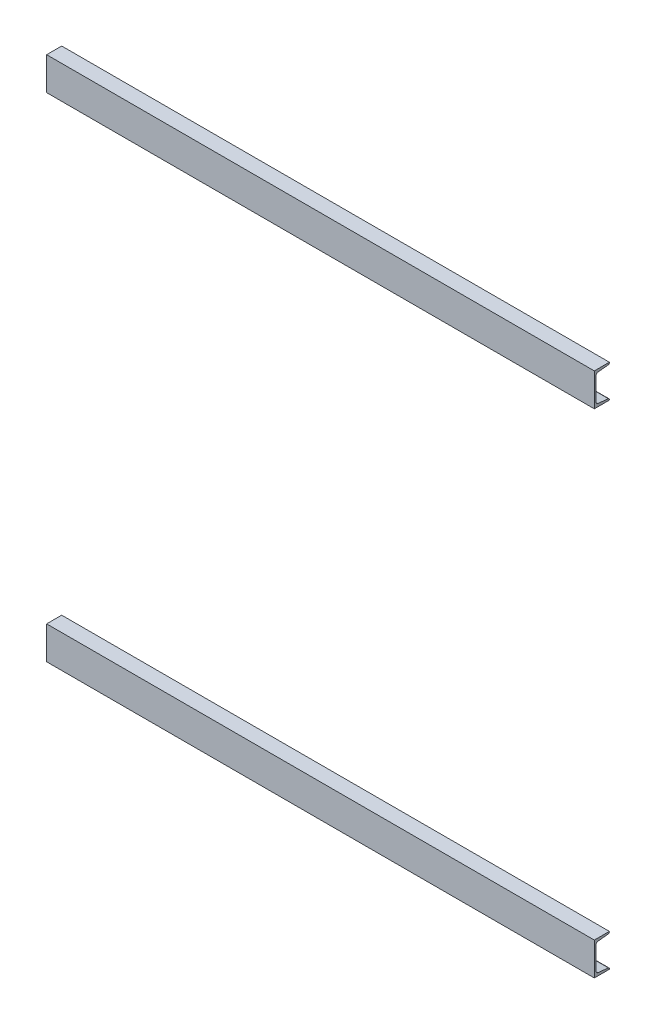
ISO-10303-21;
HEADER;
FILE_DESCRIPTION(('STEP AP214'),'2;1');
FILE_NAME('part.step','',(''),(''),'','','');
FILE_SCHEMA(('AUTOMOTIVE_DESIGN { 1 0 10303 214 1 1 1 1 }'));
ENDSEC;
DATA;
#1=APPLICATION_CONTEXT('core data for automotive mechanical design processes');
#2=APPLICATION_PROTOCOL_DEFINITION('international standard','automotive_design',2000,#1);
#3=PRODUCT_CONTEXT('',#1,'mechanical');
#4=PRODUCT('Part','Part','',(#3));
#5=PRODUCT_RELATED_PRODUCT_CATEGORY('part','',(#4));
#6=PRODUCT_DEFINITION_FORMATION('','',#4);
#7=PRODUCT_DEFINITION_CONTEXT('part definition',#1,'design');
#8=PRODUCT_DEFINITION('design','',#6,#7);
#9=PRODUCT_DEFINITION_SHAPE('','',#8);
#10=(LENGTH_UNIT() NAMED_UNIT(*) SI_UNIT(.MILLI.,.METRE.));
#11=(NAMED_UNIT(*) PLANE_ANGLE_UNIT() SI_UNIT($,.RADIAN.));
#12=(NAMED_UNIT(*) SI_UNIT($,.STERADIAN.) SOLID_ANGLE_UNIT());
#13=UNCERTAINTY_MEASURE_WITH_UNIT(LENGTH_MEASURE(1.E-05),#10,'distance_accuracy_value','');
#14=(GEOMETRIC_REPRESENTATION_CONTEXT(3) GLOBAL_UNCERTAINTY_ASSIGNED_CONTEXT((#13)) GLOBAL_UNIT_ASSIGNED_CONTEXT((#10,
#11,#12)) REPRESENTATION_CONTEXT('',''));
#15=CARTESIAN_POINT('',(0.,0.,0.));
#16=DIRECTION('',(0.,0.,1.));
#17=DIRECTION('',(1.,0.,0.));
#18=AXIS2_PLACEMENT_3D('',#15,#16,#17);
#19=CARTESIAN_POINT('',(1000.,-1018.11362681116,-50.5000000000002));
#20=DIRECTION('',(-1.,0.,0.));
#21=DIRECTION('',(0.,0.,1.));
#22=AXIS2_PLACEMENT_3D('',#19,#20,#21);
#23=CYLINDRICAL_SURFACE('',#22,4.49999999999999);
#24=CARTESIAN_POINT('',(-999.999999999999,-1018.11362681116,-50.5000000000002));
#25=DIRECTION('',(-1.,0.,0.));
#26=DIRECTION('',(0.,0.,1.));
#27=AXIS2_PLACEMENT_3D('',#24,#25,#26);
#28=CIRCLE('',#27,4.49999999999999);
#29=CARTESIAN_POINT('',(-999.999999999999,-1013.638278282,-50.9703780847046));
#30=VERTEX_POINT('',#29);
#31=CARTESIAN_POINT('',(-999.999999999999,-1018.11362681116,-55.0000000000002));
#32=VERTEX_POINT('',#31);
#33=EDGE_CURVE('E206',#30,#32,#28,.T.);
#34=ORIENTED_EDGE('',*,*,#33,.F.);
#35=DIRECTION('',(-1.,0.,0.));
#36=VECTOR('',#35,1.);
#37=CARTESIAN_POINT('',(1000.,-1013.638278282,-50.9703780847046));
#38=LINE('',#37,#36);
#39=CARTESIAN_POINT('',(1000.,-1013.638278282,-50.9703780847046));
#40=VERTEX_POINT('',#39);
#41=EDGE_CURVE('E14',#40,#30,#38,.T.);
#42=ORIENTED_EDGE('',*,*,#41,.F.);
#43=CARTESIAN_POINT('',(1000.,-1018.11362681116,-50.5000000000002));
#44=DIRECTION('',(-1.,0.,0.));
#45=DIRECTION('',(0.,0.,1.));
#46=AXIS2_PLACEMENT_3D('',#43,#44,#45);
#47=CIRCLE('',#46,4.49999999999999);
#48=CARTESIAN_POINT('',(1000.,-1018.11362681116,-55.0000000000002));
#49=VERTEX_POINT('',#48);
#50=EDGE_CURVE('E238',#40,#49,#47,.T.);
#51=ORIENTED_EDGE('',*,*,#50,.T.);
#52=DIRECTION('',(-1.,0.,0.));
#53=VECTOR('',#52,1.);
#54=CARTESIAN_POINT('',(1000.,-1018.11362681116,-55.0000000000002));
#55=LINE('',#54,#53);
#56=EDGE_CURVE('E88',#49,#32,#55,.T.);
#57=ORIENTED_EDGE('',*,*,#56,.T.);
#58=EDGE_LOOP('',(#34,#42,#51,#57));
#59=FACE_BOUND('',#58,.T.);
#60=ADVANCED_FACE('F85',(#59),#23,.T.);
#61=CARTESIAN_POINT('',(1000.,-1009.69617516295,-13.463772293859));
#62=DIRECTION('',(0.,0.994521895368275,-0.104528463267643));
#63=DIRECTION('',(0.,0.104528463267643,0.994521895368275));
#64=AXIS2_PLACEMENT_3D('',#61,#62,#63);
#65=PLANE('',#64);
#66=DIRECTION('',(0.,-0.104528463267643,-0.994521895368274));
#67=VECTOR('',#66,1.);
#68=CARTESIAN_POINT('',(-1000.,-1009.69617516295,-13.463772293859));
#69=LINE('',#68,#67);
#70=CARTESIAN_POINT('',(-1000.,-1009.69617516295,-13.463772293859));
#71=VERTEX_POINT('',#70);
#72=EDGE_CURVE('E236',#71,#30,#69,.T.);
#73=ORIENTED_EDGE('',*,*,#72,.F.);
#74=DIRECTION('',(-1.,0.,0.));
#75=VECTOR('',#74,1.);
#76=CARTESIAN_POINT('',(1000.,-1009.69617516295,-13.463772293859));
#77=LINE('',#76,#75);
#78=CARTESIAN_POINT('',(1000.,-1009.69617516295,-13.463772293859));
#79=VERTEX_POINT('',#78);
#80=EDGE_CURVE('E94',#79,#71,#77,.T.);
#81=ORIENTED_EDGE('',*,*,#80,.F.);
#82=DIRECTION('',(0.,-0.104528463267643,-0.994521895368274));
#83=VECTOR('',#82,1.);
#84=CARTESIAN_POINT('',(1000.,-1009.69617516295,-13.463772293859));
#85=LINE('',#84,#83);
#86=EDGE_CURVE('E196',#79,#40,#85,.T.);
#87=ORIENTED_EDGE('',*,*,#86,.T.);
#88=ORIENTED_EDGE('',*,*,#41,.T.);
#89=EDGE_LOOP('',(#73,#81,#87,#88));
#90=FACE_BOUND('',#89,.T.);
#91=ADVANCED_FACE('F258',(#90),#65,.T.);
#92=CARTESIAN_POINT('',(1000.,-1001.74,-14.3000000000002));
#93=DIRECTION('',(-1.,0.,0.));
#94=DIRECTION('',(0.,0.,1.));
#95=AXIS2_PLACEMENT_3D('',#92,#93,#94);
#96=CYLINDRICAL_SURFACE('',#95,8.00000000000001);
#97=CARTESIAN_POINT('',(-1000.,-1001.74,-14.3000000000002));
#98=DIRECTION('',(1.,0.,0.));
#99=DIRECTION('',(0.,0.,-1.));
#100=AXIS2_PLACEMENT_3D('',#97,#98,#99);
#101=CIRCLE('',#100,8.00000000000001);
#102=CARTESIAN_POINT('',(-1000.,-1001.74,-6.30000000000016));
#103=VERTEX_POINT('',#102);
#104=EDGE_CURVE('E183',#103,#71,#101,.T.);
#105=ORIENTED_EDGE('',*,*,#104,.F.);
#106=DIRECTION('',(-1.,0.,0.));
#107=VECTOR('',#106,1.);
#108=CARTESIAN_POINT('',(1000.,-1001.74,-6.30000000000016));
#109=LINE('',#108,#107);
#110=CARTESIAN_POINT('',(1000.,-1001.74,-6.30000000000016));
#111=VERTEX_POINT('',#110);
#112=EDGE_CURVE('E178',#111,#103,#109,.T.);
#113=ORIENTED_EDGE('',*,*,#112,.F.);
#114=CARTESIAN_POINT('',(1000.,-1001.74,-14.3000000000002));
#115=DIRECTION('',(1.,0.,0.));
#116=DIRECTION('',(0.,0.,-1.));
#117=AXIS2_PLACEMENT_3D('',#114,#115,#116);
#118=CIRCLE('',#117,8.00000000000001);
#119=EDGE_CURVE('E181',#111,#79,#118,.T.);
#120=ORIENTED_EDGE('',*,*,#119,.T.);
#121=ORIENTED_EDGE('',*,*,#80,.T.);
#122=EDGE_LOOP('',(#105,#113,#120,#121));
#123=FACE_BOUND('',#122,.T.);
#124=ADVANCED_FACE('F180',(#123),#96,.F.);
#125=CARTESIAN_POINT('',(1000.,-1001.74,-6.30000000000017));
#126=DIRECTION('',(0.,0.,-1.));
#127=DIRECTION('',(0.,1.,0.));
#128=AXIS2_PLACEMENT_3D('',#125,#126,#127);
#129=PLANE('',#128);
#130=DIRECTION('',(0.,-1.,0.));
#131=VECTOR('',#130,1.);
#132=CARTESIAN_POINT('',(-1000.,-1001.74,-6.30000000000017));
#133=LINE('',#132,#131);
#134=CARTESIAN_POINT('',(-1000.,-918.27,-6.30000000000004));
#135=VERTEX_POINT('',#134);
#136=EDGE_CURVE('E233',#135,#103,#133,.T.);
#137=ORIENTED_EDGE('',*,*,#136,.F.);
#138=DIRECTION('',(-1.,0.,0.));
#139=VECTOR('',#138,1.);
#140=CARTESIAN_POINT('',(1000.,-918.27,-6.30000000000004));
#141=LINE('',#140,#139);
#142=CARTESIAN_POINT('',(1000.,-918.27,-6.30000000000004));
#143=VERTEX_POINT('',#142);
#144=EDGE_CURVE('E188',#143,#135,#141,.T.);
#145=ORIENTED_EDGE('',*,*,#144,.F.);
#146=DIRECTION('',(0.,-1.,0.));
#147=VECTOR('',#146,1.);
#148=CARTESIAN_POINT('',(1000.,-1001.74,-6.30000000000017));
#149=LINE('',#148,#147);
#150=EDGE_CURVE('E194',#143,#111,#149,.T.);
#151=ORIENTED_EDGE('',*,*,#150,.T.);
#152=ORIENTED_EDGE('',*,*,#112,.T.);
#153=EDGE_LOOP('',(#137,#145,#151,#152));
#154=FACE_BOUND('',#153,.T.);
#155=ADVANCED_FACE('F198',(#154),#129,.T.);
#156=CARTESIAN_POINT('',(1000.,-918.27,-14.3));
#157=DIRECTION('',(-1.,0.,0.));
#158=DIRECTION('',(0.,0.,1.));
#159=AXIS2_PLACEMENT_3D('',#156,#157,#158);
#160=CYLINDRICAL_SURFACE('',#159,8.00000000000001);
#161=CARTESIAN_POINT('',(-1000.,-918.27,-14.3));
#162=DIRECTION('',(1.,0.,0.));
#163=DIRECTION('',(0.,0.,1.));
#164=AXIS2_PLACEMENT_3D('',#161,#162,#163);
#165=CIRCLE('',#164,8.00000000000001);
#166=CARTESIAN_POINT('',(-1000.,-910.313824837054,-13.4637722938589));
#167=VERTEX_POINT('',#166);
#168=EDGE_CURVE('E230',#167,#135,#165,.T.);
#169=ORIENTED_EDGE('',*,*,#168,.F.);
#170=DIRECTION('',(-1.,0.,0.));
#171=VECTOR('',#170,1.);
#172=CARTESIAN_POINT('',(1000.,-910.313824837054,-13.4637722938589));
#173=LINE('',#172,#171);
#174=CARTESIAN_POINT('',(1000.,-910.313824837054,-13.4637722938589));
#175=VERTEX_POINT('',#174);
#176=EDGE_CURVE('E242',#175,#167,#173,.T.);
#177=ORIENTED_EDGE('',*,*,#176,.F.);
#178=CARTESIAN_POINT('',(1000.,-918.27,-14.3));
#179=DIRECTION('',(1.,0.,0.));
#180=DIRECTION('',(0.,0.,1.));
#181=AXIS2_PLACEMENT_3D('',#178,#179,#180);
#182=CIRCLE('',#181,8.00000000000001);
#183=EDGE_CURVE('E199',#175,#143,#182,.T.);
#184=ORIENTED_EDGE('',*,*,#183,.T.);
#185=ORIENTED_EDGE('',*,*,#144,.T.);
#186=EDGE_LOOP('',(#169,#177,#184,#185));
#187=FACE_BOUND('',#186,.T.);
#188=ADVANCED_FACE('F271',(#187),#160,.F.);
#189=CARTESIAN_POINT('',(1000.,-910.313824837054,-13.4637722938589));
#190=DIRECTION('',(0.,-0.994521895368274,-0.104528463267647));
#191=DIRECTION('',(0.,0.104528463267647,-0.994521895368274));
#192=AXIS2_PLACEMENT_3D('',#189,#190,#191);
#193=PLANE('',#192);
#194=DIRECTION('',(0.,-0.104528463267647,0.994521895368274));
#195=VECTOR('',#194,1.);
#196=CARTESIAN_POINT('',(-1000.,-910.313824837054,-13.4637722938589));
#197=LINE('',#196,#195);
#198=CARTESIAN_POINT('',(-999.999999999999,-906.371721717996,-50.9703780847044));
#199=VERTEX_POINT('',#198);
#200=EDGE_CURVE('E227',#199,#167,#197,.T.);
#201=ORIENTED_EDGE('',*,*,#200,.F.);
#202=DIRECTION('',(-1.,0.,0.));
#203=VECTOR('',#202,1.);
#204=CARTESIAN_POINT('',(1000.,-906.371721717996,-50.9703780847044));
#205=LINE('',#204,#203);
#206=CARTESIAN_POINT('',(1000.,-906.371721717996,-50.9703780847044));
#207=VERTEX_POINT('',#206);
#208=EDGE_CURVE('E244',#207,#199,#205,.T.);
#209=ORIENTED_EDGE('',*,*,#208,.F.);
#210=DIRECTION('',(0.,-0.104528463267647,0.994521895368274));
#211=VECTOR('',#210,1.);
#212=CARTESIAN_POINT('',(1000.,-910.313824837054,-13.4637722938589));
#213=LINE('',#212,#211);
#214=EDGE_CURVE('E201',#207,#175,#213,.T.);
#215=ORIENTED_EDGE('',*,*,#214,.T.);
#216=ORIENTED_EDGE('',*,*,#176,.T.);
#217=EDGE_LOOP('',(#201,#209,#215,#216));
#218=FACE_BOUND('',#217,.T.);
#219=ADVANCED_FACE('F274',(#218),#193,.T.);
#220=CARTESIAN_POINT('',(1000.,-901.896373188839,-50.5));
#221=DIRECTION('',(-1.,0.,0.));
#222=DIRECTION('',(0.,0.,1.));
#223=AXIS2_PLACEMENT_3D('',#220,#221,#222);
#224=CYLINDRICAL_SURFACE('',#223,4.49999999999999);
#225=CARTESIAN_POINT('',(-999.999999999999,-901.896373188839,-50.5));
#226=DIRECTION('',(-1.,0.,0.));
#227=DIRECTION('',(0.,0.,-1.));
#228=AXIS2_PLACEMENT_3D('',#225,#226,#227);
#229=CIRCLE('',#228,4.49999999999999);
#230=CARTESIAN_POINT('',(-999.999999999999,-901.896373188839,-55.));
#231=VERTEX_POINT('',#230);
#232=EDGE_CURVE('E224',#231,#199,#229,.T.);
#233=ORIENTED_EDGE('',*,*,#232,.F.);
#234=DIRECTION('',(-1.,0.,0.));
#235=VECTOR('',#234,1.);
#236=CARTESIAN_POINT('',(1000.,-901.896373188839,-55.));
#237=LINE('',#236,#235);
#238=CARTESIAN_POINT('',(1000.,-901.896373188839,-55.));
#239=VERTEX_POINT('',#238);
#240=EDGE_CURVE('E246',#239,#231,#237,.T.);
#241=ORIENTED_EDGE('',*,*,#240,.F.);
#242=CARTESIAN_POINT('',(1000.,-901.896373188839,-50.5));
#243=DIRECTION('',(-1.,0.,0.));
#244=DIRECTION('',(0.,0.,-1.));
#245=AXIS2_PLACEMENT_3D('',#242,#243,#244);
#246=CIRCLE('',#245,4.49999999999999);
#247=EDGE_CURVE('E428',#239,#207,#246,.T.);
#248=ORIENTED_EDGE('',*,*,#247,.T.);
#249=ORIENTED_EDGE('',*,*,#208,.T.);
#250=EDGE_LOOP('',(#233,#241,#248,#249));
#251=FACE_BOUND('',#250,.T.);
#252=ADVANCED_FACE('F278',(#251),#224,.T.);
#253=CARTESIAN_POINT('',(1000.,-900.,-55.));
#254=DIRECTION('',(0.,0.,-1.));
#255=DIRECTION('',(0.,1.,0.));
#256=AXIS2_PLACEMENT_3D('',#253,#254,#255);
#257=PLANE('',#256);
#258=DIRECTION('',(0.,-1.,0.));
#259=VECTOR('',#258,1.);
#260=CARTESIAN_POINT('',(-999.999999999999,-900.,-55.));
#261=LINE('',#260,#259);
#262=CARTESIAN_POINT('',(-999.999999999999,-900.,-55.));
#263=VERTEX_POINT('',#262);
#264=EDGE_CURVE('E221',#263,#231,#261,.T.);
#265=ORIENTED_EDGE('',*,*,#264,.F.);
#266=DIRECTION('',(-1.,0.,0.));
#267=VECTOR('',#266,1.);
#268=CARTESIAN_POINT('',(1000.,-900.,-55.));
#269=LINE('',#268,#267);
#270=CARTESIAN_POINT('',(1000.,-900.,-55.));
#271=VERTEX_POINT('',#270);
#272=EDGE_CURVE('E248',#271,#263,#269,.T.);
#273=ORIENTED_EDGE('',*,*,#272,.F.);
#274=DIRECTION('',(0.,-1.,0.));
#275=VECTOR('',#274,1.);
#276=CARTESIAN_POINT('',(1000.,-900.,-55.));
#277=LINE('',#276,#275);
#278=EDGE_CURVE('E432',#271,#239,#277,.T.);
#279=ORIENTED_EDGE('',*,*,#278,.T.);
#280=ORIENTED_EDGE('',*,*,#240,.T.);
#281=EDGE_LOOP('',(#265,#273,#279,#280));
#282=FACE_BOUND('',#281,.T.);
#283=ADVANCED_FACE('F282',(#282),#257,.T.);
#284=CARTESIAN_POINT('',(1000.,-900.,-55.));
#285=DIRECTION('',(0.,1.,0.));
#286=DIRECTION('',(0.,0.,1.));
#287=AXIS2_PLACEMENT_3D('',#284,#285,#286);
#288=PLANE('',#287);
#289=DIRECTION('',(0.,0.,-1.));
#290=VECTOR('',#289,1.);
#291=CARTESIAN_POINT('',(-999.999999999999,-900.,-55.));
#292=LINE('',#291,#290);
#293=CARTESIAN_POINT('',(-1000.,-900.,0.));
#294=VERTEX_POINT('',#293);
#295=EDGE_CURVE('E218',#294,#263,#292,.T.);
#296=ORIENTED_EDGE('',*,*,#295,.F.);
#297=DIRECTION('',(-1.,0.,0.));
#298=VECTOR('',#297,1.);
#299=CARTESIAN_POINT('',(1000.,-900.,0.));
#300=LINE('',#299,#298);
#301=CARTESIAN_POINT('',(1000.,-900.,0.));
#302=VERTEX_POINT('',#301);
#303=EDGE_CURVE('E250',#302,#294,#300,.T.);
#304=ORIENTED_EDGE('',*,*,#303,.F.);
#305=DIRECTION('',(0.,0.,-1.));
#306=VECTOR('',#305,1.);
#307=CARTESIAN_POINT('',(1000.,-900.,-55.));
#308=LINE('',#307,#306);
#309=EDGE_CURVE('E421',#302,#271,#308,.T.);
#310=ORIENTED_EDGE('',*,*,#309,.T.);
#311=ORIENTED_EDGE('',*,*,#272,.T.);
#312=EDGE_LOOP('',(#296,#304,#310,#311));
#313=FACE_BOUND('',#312,.T.);
#314=ADVANCED_FACE('F286',(#313),#288,.T.);
#315=CARTESIAN_POINT('',(1000.,-1020.,-2.03287664669081E-13));
#316=DIRECTION('',(0.,0.,1.));
#317=DIRECTION('',(0.,-1.,0.));
#318=AXIS2_PLACEMENT_3D('',#315,#316,#317);
#319=PLANE('',#318);
#320=DIRECTION('',(0.,1.,0.));
#321=VECTOR('',#320,1.);
#322=CARTESIAN_POINT('',(-1000.,-1020.,-2.03287664669081E-13));
#323=LINE('',#322,#321);
#324=CARTESIAN_POINT('',(-1000.,-1020.,-2.03287664669081E-13));
#325=VERTEX_POINT('',#324);
#326=EDGE_CURVE('E215',#325,#294,#323,.T.);
#327=ORIENTED_EDGE('',*,*,#326,.F.);
#328=DIRECTION('',(-1.,0.,0.));
#329=VECTOR('',#328,1.);
#330=CARTESIAN_POINT('',(1000.,-1020.,-2.03287664669081E-13));
#331=LINE('',#330,#329);
#332=CARTESIAN_POINT('',(1000.,-1020.,-2.03287664669081E-13));
#333=VERTEX_POINT('',#332);
#334=EDGE_CURVE('E252',#333,#325,#331,.T.);
#335=ORIENTED_EDGE('',*,*,#334,.F.);
#336=DIRECTION('',(0.,1.,0.));
#337=VECTOR('',#336,1.);
#338=CARTESIAN_POINT('',(1000.,-1020.,-2.03287664669081E-13));
#339=LINE('',#338,#337);
#340=EDGE_CURVE('E417',#333,#302,#339,.T.);
#341=ORIENTED_EDGE('',*,*,#340,.T.);
#342=ORIENTED_EDGE('',*,*,#303,.T.);
#343=EDGE_LOOP('',(#327,#335,#341,#342));
#344=FACE_BOUND('',#343,.T.);
#345=ADVANCED_FACE('F290',(#344),#319,.T.);
#346=CARTESIAN_POINT('',(1000.,-1020.,-55.0000000000002));
#347=DIRECTION('',(0.,-1.,0.));
#348=DIRECTION('',(0.,0.,-1.));
#349=AXIS2_PLACEMENT_3D('',#346,#347,#348);
#350=PLANE('',#349);
#351=DIRECTION('',(0.,0.,1.));
#352=VECTOR('',#351,1.);
#353=CARTESIAN_POINT('',(-999.999999999999,-1020.,-55.0000000000002));
#354=LINE('',#353,#352);
#355=CARTESIAN_POINT('',(-999.999999999999,-1020.,-55.0000000000002));
#356=VERTEX_POINT('',#355);
#357=EDGE_CURVE('E212',#356,#325,#354,.T.);
#358=ORIENTED_EDGE('',*,*,#357,.F.);
#359=DIRECTION('',(-1.,0.,0.));
#360=VECTOR('',#359,1.);
#361=CARTESIAN_POINT('',(1000.,-1020.,-55.0000000000002));
#362=LINE('',#361,#360);
#363=CARTESIAN_POINT('',(1000.,-1020.,-55.0000000000002));
#364=VERTEX_POINT('',#363);
#365=EDGE_CURVE('E253',#364,#356,#362,.T.);
#366=ORIENTED_EDGE('',*,*,#365,.F.);
#367=DIRECTION('',(0.,0.,1.));
#368=VECTOR('',#367,1.);
#369=CARTESIAN_POINT('',(1000.,-1020.,-55.0000000000002));
#370=LINE('',#369,#368);
#371=EDGE_CURVE('E438',#364,#333,#370,.T.);
#372=ORIENTED_EDGE('',*,*,#371,.T.);
#373=ORIENTED_EDGE('',*,*,#334,.T.);
#374=EDGE_LOOP('',(#358,#366,#372,#373));
#375=FACE_BOUND('',#374,.T.);
#376=ADVANCED_FACE('F294',(#375),#350,.T.);
#377=CARTESIAN_POINT('',(1000.,-1020.,-55.0000000000002));
#378=DIRECTION('',(0.,0.,-1.));
#379=DIRECTION('',(0.,1.,0.));
#380=AXIS2_PLACEMENT_3D('',#377,#378,#379);
#381=PLANE('',#380);
#382=DIRECTION('',(0.,-1.,0.));
#383=VECTOR('',#382,1.);
#384=CARTESIAN_POINT('',(-999.999999999999,-1020.,-55.0000000000002));
#385=LINE('',#384,#383);
#386=EDGE_CURVE('E209',#32,#356,#385,.T.);
#387=ORIENTED_EDGE('',*,*,#386,.F.);
#388=ORIENTED_EDGE('',*,*,#56,.F.);
#389=DIRECTION('',(0.,-1.,0.));
#390=VECTOR('',#389,1.);
#391=CARTESIAN_POINT('',(1000.,-1020.,-55.0000000000002));
#392=LINE('',#391,#390);
#393=EDGE_CURVE('E440',#49,#364,#392,.T.);
#394=ORIENTED_EDGE('',*,*,#393,.T.);
#395=ORIENTED_EDGE('',*,*,#365,.T.);
#396=EDGE_LOOP('',(#387,#388,#394,#395));
#397=FACE_BOUND('',#396,.T.);
#398=ADVANCED_FACE('F255',(#397),#381,.T.);
#399=CARTESIAN_POINT('',(1000.,-1018.11362681116,-50.5000000000002));
#400=DIRECTION('',(-1.,0.,0.));
#401=DIRECTION('',(0.,0.,1.));
#402=AXIS2_PLACEMENT_3D('',#399,#400,#401);
#403=PLANE('',#402);
#404=ORIENTED_EDGE('',*,*,#50,.F.);
#405=ORIENTED_EDGE('',*,*,#86,.F.);
#406=ORIENTED_EDGE('',*,*,#119,.F.);
#407=ORIENTED_EDGE('',*,*,#150,.F.);
#408=ORIENTED_EDGE('',*,*,#183,.F.);
#409=ORIENTED_EDGE('',*,*,#214,.F.);
#410=ORIENTED_EDGE('',*,*,#247,.F.);
#411=ORIENTED_EDGE('',*,*,#278,.F.);
#412=ORIENTED_EDGE('',*,*,#309,.F.);
#413=ORIENTED_EDGE('',*,*,#340,.F.);
#414=ORIENTED_EDGE('',*,*,#371,.F.);
#415=ORIENTED_EDGE('',*,*,#393,.F.);
#416=EDGE_LOOP('',(#404,#405,#406,#407,#408,#409,#410,#411,#412,#413,#414,#415));
#417=FACE_BOUND('',#416,.T.);
#418=ADVANCED_FACE('F192',(#417),#403,.F.);
#419=CARTESIAN_POINT('',(-999.999999999999,-1018.11362681116,-50.5000000000002));
#420=DIRECTION('',(-1.,0.,0.));
#421=DIRECTION('',(0.,0.,1.));
#422=AXIS2_PLACEMENT_3D('',#419,#420,#421);
#423=PLANE('',#422);
#424=ORIENTED_EDGE('',*,*,#33,.T.);
#425=ORIENTED_EDGE('',*,*,#386,.T.);
#426=ORIENTED_EDGE('',*,*,#357,.T.);
#427=ORIENTED_EDGE('',*,*,#326,.T.);
#428=ORIENTED_EDGE('',*,*,#295,.T.);
#429=ORIENTED_EDGE('',*,*,#264,.T.);
#430=ORIENTED_EDGE('',*,*,#232,.T.);
#431=ORIENTED_EDGE('',*,*,#200,.T.);
#432=ORIENTED_EDGE('',*,*,#168,.T.);
#433=ORIENTED_EDGE('',*,*,#136,.T.);
#434=ORIENTED_EDGE('',*,*,#104,.T.);
#435=ORIENTED_EDGE('',*,*,#72,.T.);
#436=EDGE_LOOP('',(#424,#425,#426,#427,#428,#429,#430,#431,#432,#433,#434,#435));
#437=FACE_BOUND('',#436,.T.);
#438=ADVANCED_FACE('F257',(#437),#423,.T.);
#439=CLOSED_SHELL('',(#60,#91,#124,#155,#188,#219,#252,#283,#314,#345,#376,#398,#418,#438));
#440=MANIFOLD_SOLID_BREP('B2',#439);
#441=CARTESIAN_POINT('',(1000.,781.886373188839,-50.5000000000002));
#442=DIRECTION('',(-1.,0.,0.));
#443=DIRECTION('',(0.,0.,1.));
#444=AXIS2_PLACEMENT_3D('',#441,#442,#443);
#445=CYLINDRICAL_SURFACE('',#444,4.49999999999999);
#446=CARTESIAN_POINT('',(-999.999999999999,781.886373188839,-50.5000000000002));
#447=DIRECTION('',(-1.,0.,0.));
#448=DIRECTION('',(0.,0.,1.));
#449=AXIS2_PLACEMENT_3D('',#446,#447,#448);
#450=CIRCLE('',#449,4.49999999999999);
#451=CARTESIAN_POINT('',(-999.999999999999,786.361721717996,-50.9703780847046));
#452=VERTEX_POINT('',#451);
#453=CARTESIAN_POINT('',(-999.999999999999,781.886373188839,-55.0000000000002));
#454=VERTEX_POINT('',#453);
#455=EDGE_CURVE('E565',#452,#454,#450,.T.);
#456=ORIENTED_EDGE('',*,*,#455,.F.);
#457=DIRECTION('',(-1.,0.,0.));
#458=VECTOR('',#457,1.);
#459=CARTESIAN_POINT('',(1000.,786.361721717996,-50.9703780847046));
#460=LINE('',#459,#458);
#461=CARTESIAN_POINT('',(1000.,786.361721717996,-50.9703780847046));
#462=VERTEX_POINT('',#461);
#463=EDGE_CURVE('E83',#462,#452,#460,.T.);
#464=ORIENTED_EDGE('',*,*,#463,.F.);
#465=CARTESIAN_POINT('',(1000.,781.886373188839,-50.5000000000002));
#466=DIRECTION('',(-1.,0.,0.));
#467=DIRECTION('',(0.,0.,1.));
#468=AXIS2_PLACEMENT_3D('',#465,#466,#467);
#469=CIRCLE('',#468,4.49999999999999);
#470=CARTESIAN_POINT('',(1000.,781.886373188839,-55.0000000000002));
#471=VERTEX_POINT('',#470);
#472=EDGE_CURVE('E597',#462,#471,#469,.T.);
#473=ORIENTED_EDGE('',*,*,#472,.T.);
#474=DIRECTION('',(-1.,0.,0.));
#475=VECTOR('',#474,1.);
#476=CARTESIAN_POINT('',(1000.,781.886373188839,-55.0000000000002));
#477=LINE('',#476,#475);
#478=EDGE_CURVE('E447',#471,#454,#477,.T.);
#479=ORIENTED_EDGE('',*,*,#478,.T.);
#480=EDGE_LOOP('',(#456,#464,#473,#479));
#481=FACE_BOUND('',#480,.T.);
#482=ADVANCED_FACE('F444',(#481),#445,.T.);
#483=CARTESIAN_POINT('',(1000.,790.303824837054,-13.463772293859));
#484=DIRECTION('',(0.,0.994521895368275,-0.104528463267643));
#485=DIRECTION('',(0.,0.104528463267643,0.994521895368275));
#486=AXIS2_PLACEMENT_3D('',#483,#484,#485);
#487=PLANE('',#486);
#488=DIRECTION('',(0.,-0.104528463267643,-0.994521895368274));
#489=VECTOR('',#488,1.);
#490=CARTESIAN_POINT('',(-1000.,790.303824837054,-13.463772293859));
#491=LINE('',#490,#489);
#492=CARTESIAN_POINT('',(-1000.,790.303824837054,-13.463772293859));
#493=VERTEX_POINT('',#492);
#494=EDGE_CURVE('E595',#493,#452,#491,.T.);
#495=ORIENTED_EDGE('',*,*,#494,.F.);
#496=DIRECTION('',(-1.,0.,0.));
#497=VECTOR('',#496,1.);
#498=CARTESIAN_POINT('',(1000.,790.303824837054,-13.463772293859));
#499=LINE('',#498,#497);
#500=CARTESIAN_POINT('',(1000.,790.303824837054,-13.463772293859));
#501=VERTEX_POINT('',#500);
#502=EDGE_CURVE('E453',#501,#493,#499,.T.);
#503=ORIENTED_EDGE('',*,*,#502,.F.);
#504=DIRECTION('',(0.,-0.104528463267643,-0.994521895368274));
#505=VECTOR('',#504,1.);
#506=CARTESIAN_POINT('',(1000.,790.303824837054,-13.463772293859));
#507=LINE('',#506,#505);
#508=EDGE_CURVE('E555',#501,#462,#507,.T.);
#509=ORIENTED_EDGE('',*,*,#508,.T.);
#510=ORIENTED_EDGE('',*,*,#463,.T.);
#511=EDGE_LOOP('',(#495,#503,#509,#510));
#512=FACE_BOUND('',#511,.T.);
#513=ADVANCED_FACE('F617',(#512),#487,.T.);
#514=CARTESIAN_POINT('',(1000.,798.26,-14.3000000000002));
#515=DIRECTION('',(-1.,0.,0.));
#516=DIRECTION('',(0.,0.,1.));
#517=AXIS2_PLACEMENT_3D('',#514,#515,#516);
#518=CYLINDRICAL_SURFACE('',#517,8.00000000000001);
#519=CARTESIAN_POINT('',(-1000.,798.26,-14.3000000000002));
#520=DIRECTION('',(1.,0.,0.));
#521=DIRECTION('',(0.,0.,-1.));
#522=AXIS2_PLACEMENT_3D('',#519,#520,#521);
#523=CIRCLE('',#522,8.00000000000001);
#524=CARTESIAN_POINT('',(-1000.,798.26,-6.30000000000016));
#525=VERTEX_POINT('',#524);
#526=EDGE_CURVE('E542',#525,#493,#523,.T.);
#527=ORIENTED_EDGE('',*,*,#526,.F.);
#528=DIRECTION('',(-1.,0.,0.));
#529=VECTOR('',#528,1.);
#530=CARTESIAN_POINT('',(1000.,798.26,-6.30000000000016));
#531=LINE('',#530,#529);
#532=CARTESIAN_POINT('',(1000.,798.26,-6.30000000000016));
#533=VERTEX_POINT('',#532);
#534=EDGE_CURVE('E537',#533,#525,#531,.T.);
#535=ORIENTED_EDGE('',*,*,#534,.F.);
#536=CARTESIAN_POINT('',(1000.,798.26,-14.3000000000002));
#537=DIRECTION('',(1.,0.,0.));
#538=DIRECTION('',(0.,0.,-1.));
#539=AXIS2_PLACEMENT_3D('',#536,#537,#538);
#540=CIRCLE('',#539,8.00000000000001);
#541=EDGE_CURVE('E540',#533,#501,#540,.T.);
#542=ORIENTED_EDGE('',*,*,#541,.T.);
#543=ORIENTED_EDGE('',*,*,#502,.T.);
#544=EDGE_LOOP('',(#527,#535,#542,#543));
#545=FACE_BOUND('',#544,.T.);
#546=ADVANCED_FACE('F539',(#545),#518,.F.);
#547=CARTESIAN_POINT('',(1000.,798.26,-6.30000000000017));
#548=DIRECTION('',(0.,0.,-1.));
#549=DIRECTION('',(0.,1.,0.));
#550=AXIS2_PLACEMENT_3D('',#547,#548,#549);
#551=PLANE('',#550);
#552=DIRECTION('',(0.,-1.,0.));
#553=VECTOR('',#552,1.);
#554=CARTESIAN_POINT('',(-1000.,798.26,-6.30000000000017));
#555=LINE('',#554,#553);
#556=CARTESIAN_POINT('',(-1000.,881.73,-6.30000000000004));
#557=VERTEX_POINT('',#556);
#558=EDGE_CURVE('E592',#557,#525,#555,.T.);
#559=ORIENTED_EDGE('',*,*,#558,.F.);
#560=DIRECTION('',(-1.,0.,0.));
#561=VECTOR('',#560,1.);
#562=CARTESIAN_POINT('',(1000.,881.73,-6.30000000000004));
#563=LINE('',#562,#561);
#564=CARTESIAN_POINT('',(1000.,881.73,-6.30000000000004));
#565=VERTEX_POINT('',#564);
#566=EDGE_CURVE('E547',#565,#557,#563,.T.);
#567=ORIENTED_EDGE('',*,*,#566,.F.);
#568=DIRECTION('',(0.,-1.,0.));
#569=VECTOR('',#568,1.);
#570=CARTESIAN_POINT('',(1000.,798.26,-6.30000000000017));
#571=LINE('',#570,#569);
#572=EDGE_CURVE('E553',#565,#533,#571,.T.);
#573=ORIENTED_EDGE('',*,*,#572,.T.);
#574=ORIENTED_EDGE('',*,*,#534,.T.);
#575=EDGE_LOOP('',(#559,#567,#573,#574));
#576=FACE_BOUND('',#575,.T.);
#577=ADVANCED_FACE('F557',(#576),#551,.T.);
#578=CARTESIAN_POINT('',(1000.,881.73,-14.3));
#579=DIRECTION('',(-1.,0.,0.));
#580=DIRECTION('',(0.,0.,1.));
#581=AXIS2_PLACEMENT_3D('',#578,#579,#580);
#582=CYLINDRICAL_SURFACE('',#581,8.00000000000001);
#583=CARTESIAN_POINT('',(-1000.,881.73,-14.3));
#584=DIRECTION('',(1.,0.,0.));
#585=DIRECTION('',(0.,0.,1.));
#586=AXIS2_PLACEMENT_3D('',#583,#584,#585);
#587=CIRCLE('',#586,8.00000000000001);
#588=CARTESIAN_POINT('',(-1000.,889.686175162946,-13.4637722938589));
#589=VERTEX_POINT('',#588);
#590=EDGE_CURVE('E589',#589,#557,#587,.T.);
#591=ORIENTED_EDGE('',*,*,#590,.F.);
#592=DIRECTION('',(-1.,0.,0.));
#593=VECTOR('',#592,1.);
#594=CARTESIAN_POINT('',(1000.,889.686175162946,-13.4637722938589));
#595=LINE('',#594,#593);
#596=CARTESIAN_POINT('',(1000.,889.686175162946,-13.4637722938589));
#597=VERTEX_POINT('',#596);
#598=EDGE_CURVE('E601',#597,#589,#595,.T.);
#599=ORIENTED_EDGE('',*,*,#598,.F.);
#600=CARTESIAN_POINT('',(1000.,881.73,-14.3));
#601=DIRECTION('',(1.,0.,0.));
#602=DIRECTION('',(0.,0.,1.));
#603=AXIS2_PLACEMENT_3D('',#600,#601,#602);
#604=CIRCLE('',#603,8.00000000000001);
#605=EDGE_CURVE('E558',#597,#565,#604,.T.);
#606=ORIENTED_EDGE('',*,*,#605,.T.);
#607=ORIENTED_EDGE('',*,*,#566,.T.);
#608=EDGE_LOOP('',(#591,#599,#606,#607));
#609=FACE_BOUND('',#608,.T.);
#610=ADVANCED_FACE('F630',(#609),#582,.F.);
#611=CARTESIAN_POINT('',(1000.,889.686175162946,-13.4637722938589));
#612=DIRECTION('',(0.,-0.994521895368274,-0.104528463267647));
#613=DIRECTION('',(0.,0.104528463267647,-0.994521895368274));
#614=AXIS2_PLACEMENT_3D('',#611,#612,#613);
#615=PLANE('',#614);
#616=DIRECTION('',(0.,-0.104528463267647,0.994521895368274));
#617=VECTOR('',#616,1.);
#618=CARTESIAN_POINT('',(-1000.,889.686175162946,-13.4637722938589));
#619=LINE('',#618,#617);
#620=CARTESIAN_POINT('',(-999.999999999999,893.628278282004,-50.9703780847044));
#621=VERTEX_POINT('',#620);
#622=EDGE_CURVE('E586',#621,#589,#619,.T.);
#623=ORIENTED_EDGE('',*,*,#622,.F.);
#624=DIRECTION('',(-1.,0.,0.));
#625=VECTOR('',#624,1.);
#626=CARTESIAN_POINT('',(1000.,893.628278282004,-50.9703780847044));
#627=LINE('',#626,#625);
#628=CARTESIAN_POINT('',(1000.,893.628278282004,-50.9703780847044));
#629=VERTEX_POINT('',#628);
#630=EDGE_CURVE('E603',#629,#621,#627,.T.);
#631=ORIENTED_EDGE('',*,*,#630,.F.);
#632=DIRECTION('',(0.,-0.104528463267647,0.994521895368274));
#633=VECTOR('',#632,1.);
#634=CARTESIAN_POINT('',(1000.,889.686175162946,-13.4637722938589));
#635=LINE('',#634,#633);
#636=EDGE_CURVE('E560',#629,#597,#635,.T.);
#637=ORIENTED_EDGE('',*,*,#636,.T.);
#638=ORIENTED_EDGE('',*,*,#598,.T.);
#639=EDGE_LOOP('',(#623,#631,#637,#638));
#640=FACE_BOUND('',#639,.T.);
#641=ADVANCED_FACE('F633',(#640),#615,.T.);
#642=CARTESIAN_POINT('',(1000.,898.103626811161,-50.5));
#643=DIRECTION('',(-1.,0.,0.));
#644=DIRECTION('',(0.,0.,1.));
#645=AXIS2_PLACEMENT_3D('',#642,#643,#644);
#646=CYLINDRICAL_SURFACE('',#645,4.49999999999999);
#647=CARTESIAN_POINT('',(-999.999999999999,898.103626811161,-50.5));
#648=DIRECTION('',(-1.,0.,0.));
#649=DIRECTION('',(0.,0.,-1.));
#650=AXIS2_PLACEMENT_3D('',#647,#648,#649);
#651=CIRCLE('',#650,4.49999999999999);
#652=CARTESIAN_POINT('',(-999.999999999999,898.103626811161,-55.));
#653=VERTEX_POINT('',#652);
#654=EDGE_CURVE('E583',#653,#621,#651,.T.);
#655=ORIENTED_EDGE('',*,*,#654,.F.);
#656=DIRECTION('',(-1.,0.,0.));
#657=VECTOR('',#656,1.);
#658=CARTESIAN_POINT('',(1000.,898.103626811161,-55.));
#659=LINE('',#658,#657);
#660=CARTESIAN_POINT('',(1000.,898.103626811161,-55.));
#661=VERTEX_POINT('',#660);
#662=EDGE_CURVE('E605',#661,#653,#659,.T.);
#663=ORIENTED_EDGE('',*,*,#662,.F.);
#664=CARTESIAN_POINT('',(1000.,898.103626811161,-50.5));
#665=DIRECTION('',(-1.,0.,0.));
#666=DIRECTION('',(0.,0.,-1.));
#667=AXIS2_PLACEMENT_3D('',#664,#665,#666);
#668=CIRCLE('',#667,4.49999999999999);
#669=EDGE_CURVE('E787',#661,#629,#668,.T.);
#670=ORIENTED_EDGE('',*,*,#669,.T.);
#671=ORIENTED_EDGE('',*,*,#630,.T.);
#672=EDGE_LOOP('',(#655,#663,#670,#671));
#673=FACE_BOUND('',#672,.T.);
#674=ADVANCED_FACE('F637',(#673),#646,.T.);
#675=CARTESIAN_POINT('',(1000.,900.,-55.));
#676=DIRECTION('',(0.,0.,-1.));
#677=DIRECTION('',(0.,1.,0.));
#678=AXIS2_PLACEMENT_3D('',#675,#676,#677);
#679=PLANE('',#678);
#680=DIRECTION('',(0.,-1.,0.));
#681=VECTOR('',#680,1.);
#682=CARTESIAN_POINT('',(-999.999999999999,900.,-55.));
#683=LINE('',#682,#681);
#684=CARTESIAN_POINT('',(-999.999999999999,900.,-55.));
#685=VERTEX_POINT('',#684);
#686=EDGE_CURVE('E580',#685,#653,#683,.T.);
#687=ORIENTED_EDGE('',*,*,#686,.F.);
#688=DIRECTION('',(-1.,0.,0.));
#689=VECTOR('',#688,1.);
#690=CARTESIAN_POINT('',(1000.,900.,-55.));
#691=LINE('',#690,#689);
#692=CARTESIAN_POINT('',(1000.,900.,-55.));
#693=VERTEX_POINT('',#692);
#694=EDGE_CURVE('E607',#693,#685,#691,.T.);
#695=ORIENTED_EDGE('',*,*,#694,.F.);
#696=DIRECTION('',(0.,-1.,0.));
#697=VECTOR('',#696,1.);
#698=CARTESIAN_POINT('',(1000.,900.,-55.));
#699=LINE('',#698,#697);
#700=EDGE_CURVE('E791',#693,#661,#699,.T.);
#701=ORIENTED_EDGE('',*,*,#700,.T.);
#702=ORIENTED_EDGE('',*,*,#662,.T.);
#703=EDGE_LOOP('',(#687,#695,#701,#702));
#704=FACE_BOUND('',#703,.T.);
#705=ADVANCED_FACE('F641',(#704),#679,.T.);
#706=CARTESIAN_POINT('',(1000.,900.,-55.));
#707=DIRECTION('',(0.,1.,0.));
#708=DIRECTION('',(0.,0.,1.));
#709=AXIS2_PLACEMENT_3D('',#706,#707,#708);
#710=PLANE('',#709);
#711=DIRECTION('',(0.,0.,-1.));
#712=VECTOR('',#711,1.);
#713=CARTESIAN_POINT('',(-999.999999999999,900.,-55.));
#714=LINE('',#713,#712);
#715=CARTESIAN_POINT('',(-1000.,900.,0.));
#716=VERTEX_POINT('',#715);
#717=EDGE_CURVE('E577',#716,#685,#714,.T.);
#718=ORIENTED_EDGE('',*,*,#717,.F.);
#719=DIRECTION('',(-1.,0.,0.));
#720=VECTOR('',#719,1.);
#721=CARTESIAN_POINT('',(1000.,900.,0.));
#722=LINE('',#721,#720);
#723=CARTESIAN_POINT('',(1000.,900.,0.));
#724=VERTEX_POINT('',#723);
#725=EDGE_CURVE('E609',#724,#716,#722,.T.);
#726=ORIENTED_EDGE('',*,*,#725,.F.);
#727=DIRECTION('',(0.,0.,-1.));
#728=VECTOR('',#727,1.);
#729=CARTESIAN_POINT('',(1000.,900.,-55.));
#730=LINE('',#729,#728);
#731=EDGE_CURVE('E780',#724,#693,#730,.T.);
#732=ORIENTED_EDGE('',*,*,#731,.T.);
#733=ORIENTED_EDGE('',*,*,#694,.T.);
#734=EDGE_LOOP('',(#718,#726,#732,#733));
#735=FACE_BOUND('',#734,.T.);
#736=ADVANCED_FACE('F645',(#735),#710,.T.);
#737=CARTESIAN_POINT('',(1000.,780.,-2.03287664669081E-13));
#738=DIRECTION('',(0.,0.,1.));
#739=DIRECTION('',(0.,-1.,0.));
#740=AXIS2_PLACEMENT_3D('',#737,#738,#739);
#741=PLANE('',#740);
#742=DIRECTION('',(0.,1.,0.));
#743=VECTOR('',#742,1.);
#744=CARTESIAN_POINT('',(-1000.,780.,-2.03287664669081E-13));
#745=LINE('',#744,#743);
#746=CARTESIAN_POINT('',(-1000.,780.,-2.03287664669081E-13));
#747=VERTEX_POINT('',#746);
#748=EDGE_CURVE('E574',#747,#716,#745,.T.);
#749=ORIENTED_EDGE('',*,*,#748,.F.);
#750=DIRECTION('',(-1.,0.,0.));
#751=VECTOR('',#750,1.);
#752=CARTESIAN_POINT('',(1000.,780.,-2.03287664669081E-13));
#753=LINE('',#752,#751);
#754=CARTESIAN_POINT('',(1000.,780.,-2.03287664669081E-13));
#755=VERTEX_POINT('',#754);
#756=EDGE_CURVE('E611',#755,#747,#753,.T.);
#757=ORIENTED_EDGE('',*,*,#756,.F.);
#758=DIRECTION('',(0.,1.,0.));
#759=VECTOR('',#758,1.);
#760=CARTESIAN_POINT('',(1000.,780.,-2.03287664669081E-13));
#761=LINE('',#760,#759);
#762=EDGE_CURVE('E776',#755,#724,#761,.T.);
#763=ORIENTED_EDGE('',*,*,#762,.T.);
#764=ORIENTED_EDGE('',*,*,#725,.T.);
#765=EDGE_LOOP('',(#749,#757,#763,#764));
#766=FACE_BOUND('',#765,.T.);
#767=ADVANCED_FACE('F649',(#766),#741,.T.);
#768=CARTESIAN_POINT('',(1000.,780.,-55.0000000000002));
#769=DIRECTION('',(0.,-1.,0.));
#770=DIRECTION('',(0.,0.,-1.));
#771=AXIS2_PLACEMENT_3D('',#768,#769,#770);
#772=PLANE('',#771);
#773=DIRECTION('',(0.,0.,1.));
#774=VECTOR('',#773,1.);
#775=CARTESIAN_POINT('',(-999.999999999999,780.,-55.0000000000002));
#776=LINE('',#775,#774);
#777=CARTESIAN_POINT('',(-999.999999999999,780.,-55.0000000000002));
#778=VERTEX_POINT('',#777);
#779=EDGE_CURVE('E571',#778,#747,#776,.T.);
#780=ORIENTED_EDGE('',*,*,#779,.F.);
#781=DIRECTION('',(-1.,0.,0.));
#782=VECTOR('',#781,1.);
#783=CARTESIAN_POINT('',(1000.,780.,-55.0000000000002));
#784=LINE('',#783,#782);
#785=CARTESIAN_POINT('',(1000.,780.,-55.0000000000002));
#786=VERTEX_POINT('',#785);
#787=EDGE_CURVE('E612',#786,#778,#784,.T.);
#788=ORIENTED_EDGE('',*,*,#787,.F.);
#789=DIRECTION('',(0.,0.,1.));
#790=VECTOR('',#789,1.);
#791=CARTESIAN_POINT('',(1000.,780.,-55.0000000000002));
#792=LINE('',#791,#790);
#793=EDGE_CURVE('E797',#786,#755,#792,.T.);
#794=ORIENTED_EDGE('',*,*,#793,.T.);
#795=ORIENTED_EDGE('',*,*,#756,.T.);
#796=EDGE_LOOP('',(#780,#788,#794,#795));
#797=FACE_BOUND('',#796,.T.);
#798=ADVANCED_FACE('F653',(#797),#772,.T.);
#799=CARTESIAN_POINT('',(1000.,780.,-55.0000000000002));
#800=DIRECTION('',(0.,0.,-1.));
#801=DIRECTION('',(0.,1.,0.));
#802=AXIS2_PLACEMENT_3D('',#799,#800,#801);
#803=PLANE('',#802);
#804=DIRECTION('',(0.,-1.,0.));
#805=VECTOR('',#804,1.);
#806=CARTESIAN_POINT('',(-999.999999999999,780.,-55.0000000000002));
#807=LINE('',#806,#805);
#808=EDGE_CURVE('E568',#454,#778,#807,.T.);
#809=ORIENTED_EDGE('',*,*,#808,.F.);
#810=ORIENTED_EDGE('',*,*,#478,.F.);
#811=DIRECTION('',(0.,-1.,0.));
#812=VECTOR('',#811,1.);
#813=CARTESIAN_POINT('',(1000.,780.,-55.0000000000002));
#814=LINE('',#813,#812);
#815=EDGE_CURVE('E799',#471,#786,#814,.T.);
#816=ORIENTED_EDGE('',*,*,#815,.T.);
#817=ORIENTED_EDGE('',*,*,#787,.T.);
#818=EDGE_LOOP('',(#809,#810,#816,#817));
#819=FACE_BOUND('',#818,.T.);
#820=ADVANCED_FACE('F614',(#819),#803,.T.);
#821=CARTESIAN_POINT('',(1000.,781.886373188839,-50.5000000000002));
#822=DIRECTION('',(-1.,0.,0.));
#823=DIRECTION('',(0.,0.,1.));
#824=AXIS2_PLACEMENT_3D('',#821,#822,#823);
#825=PLANE('',#824);
#826=ORIENTED_EDGE('',*,*,#472,.F.);
#827=ORIENTED_EDGE('',*,*,#508,.F.);
#828=ORIENTED_EDGE('',*,*,#541,.F.);
#829=ORIENTED_EDGE('',*,*,#572,.F.);
#830=ORIENTED_EDGE('',*,*,#605,.F.);
#831=ORIENTED_EDGE('',*,*,#636,.F.);
#832=ORIENTED_EDGE('',*,*,#669,.F.);
#833=ORIENTED_EDGE('',*,*,#700,.F.);
#834=ORIENTED_EDGE('',*,*,#731,.F.);
#835=ORIENTED_EDGE('',*,*,#762,.F.);
#836=ORIENTED_EDGE('',*,*,#793,.F.);
#837=ORIENTED_EDGE('',*,*,#815,.F.);
#838=EDGE_LOOP('',(#826,#827,#828,#829,#830,#831,#832,#833,#834,#835,#836,#837));
#839=FACE_BOUND('',#838,.T.);
#840=ADVANCED_FACE('F551',(#839),#825,.F.);
#841=CARTESIAN_POINT('',(-999.999999999999,781.886373188839,-50.5000000000002));
#842=DIRECTION('',(-1.,0.,0.));
#843=DIRECTION('',(0.,0.,1.));
#844=AXIS2_PLACEMENT_3D('',#841,#842,#843);
#845=PLANE('',#844);
#846=ORIENTED_EDGE('',*,*,#455,.T.);
#847=ORIENTED_EDGE('',*,*,#808,.T.);
#848=ORIENTED_EDGE('',*,*,#779,.T.);
#849=ORIENTED_EDGE('',*,*,#748,.T.);
#850=ORIENTED_EDGE('',*,*,#717,.T.);
#851=ORIENTED_EDGE('',*,*,#686,.T.);
#852=ORIENTED_EDGE('',*,*,#654,.T.);
#853=ORIENTED_EDGE('',*,*,#622,.T.);
#854=ORIENTED_EDGE('',*,*,#590,.T.);
#855=ORIENTED_EDGE('',*,*,#558,.T.);
#856=ORIENTED_EDGE('',*,*,#526,.T.);
#857=ORIENTED_EDGE('',*,*,#494,.T.);
#858=EDGE_LOOP('',(#846,#847,#848,#849,#850,#851,#852,#853,#854,#855,#856,#857));
#859=FACE_BOUND('',#858,.T.);
#860=ADVANCED_FACE('F616',(#859),#845,.T.);
#861=CLOSED_SHELL('',(#482,#513,#546,#577,#610,#641,#674,#705,#736,#767,#798,#820,#840,#860));
#862=MANIFOLD_SOLID_BREP('B8',#861);
#863=ADVANCED_BREP_SHAPE_REPRESENTATION('',(#18,#440,#862),#14);
#864=SHAPE_DEFINITION_REPRESENTATION(#9,#863);
ENDSEC;
END-ISO-10303-21;
